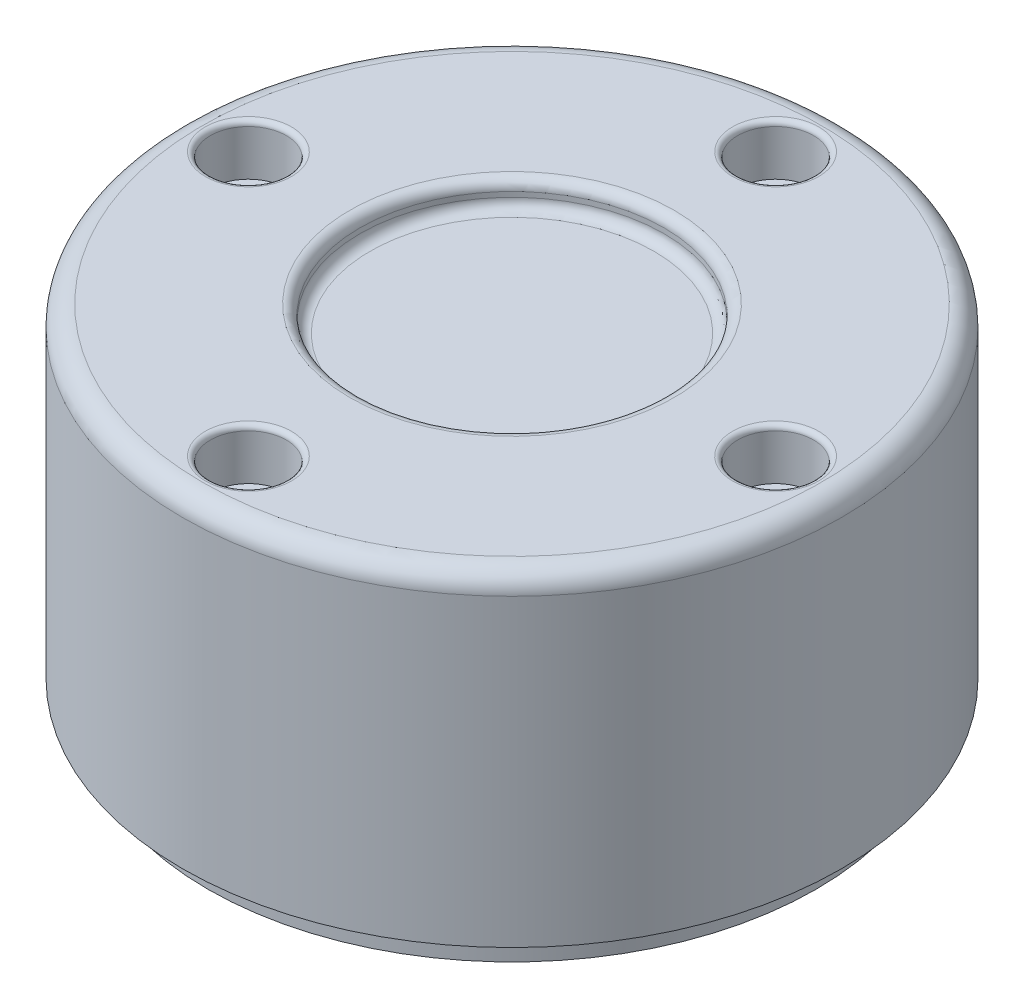
ISO-10303-21;
HEADER;
FILE_DESCRIPTION(('STEP AP214'),'2;1');
FILE_NAME('part.step','',(''),(''),'','','');
FILE_SCHEMA(('AUTOMOTIVE_DESIGN { 1 0 10303 214 1 1 1 1 }'));
ENDSEC;
DATA;
#1=APPLICATION_CONTEXT('core data for automotive mechanical design processes');
#2=APPLICATION_PROTOCOL_DEFINITION('international standard','automotive_design',2000,#1);
#3=PRODUCT_CONTEXT('',#1,'mechanical');
#4=PRODUCT('Part','Part','',(#3));
#5=PRODUCT_RELATED_PRODUCT_CATEGORY('part','',(#4));
#6=PRODUCT_DEFINITION_FORMATION('','',#4);
#7=PRODUCT_DEFINITION_CONTEXT('part definition',#1,'design');
#8=PRODUCT_DEFINITION('design','',#6,#7);
#9=PRODUCT_DEFINITION_SHAPE('','',#8);
#10=(LENGTH_UNIT() NAMED_UNIT(*) SI_UNIT(.MILLI.,.METRE.));
#11=(NAMED_UNIT(*) PLANE_ANGLE_UNIT() SI_UNIT($,.RADIAN.));
#12=(NAMED_UNIT(*) SI_UNIT($,.STERADIAN.) SOLID_ANGLE_UNIT());
#13=UNCERTAINTY_MEASURE_WITH_UNIT(LENGTH_MEASURE(1.E-05),#10,'distance_accuracy_value','');
#14=(GEOMETRIC_REPRESENTATION_CONTEXT(3) GLOBAL_UNCERTAINTY_ASSIGNED_CONTEXT((#13)) GLOBAL_UNIT_ASSIGNED_CONTEXT((#10,
#11,#12)) REPRESENTATION_CONTEXT('',''));
#15=CARTESIAN_POINT('',(0.,0.,0.));
#16=DIRECTION('',(0.,0.,1.));
#17=DIRECTION('',(1.,0.,0.));
#18=AXIS2_PLACEMENT_3D('',#15,#16,#17);
#19=CARTESIAN_POINT('',(0.,3.,0.));
#20=DIRECTION('',(0.,-1.,0.));
#21=DIRECTION('',(0.,0.,-1.));
#22=AXIS2_PLACEMENT_3D('',#19,#20,#21);
#23=CYLINDRICAL_SURFACE('',#22,30.);
#24=CARTESIAN_POINT('',(0.,3.,0.));
#25=DIRECTION('',(0.,1.,0.));
#26=DIRECTION('',(0.,0.,1.));
#27=AXIS2_PLACEMENT_3D('',#24,#25,#26);
#28=CIRCLE('',#27,30.);
#29=CARTESIAN_POINT('',(0.,3.,30.));
#30=VERTEX_POINT('',#29);
#31=EDGE_CURVE('E82',#30,#30,#28,.T.);
#32=ORIENTED_EDGE('',*,*,#31,.F.);
#33=EDGE_LOOP('',(#32));
#34=FACE_BOUND('',#33,.T.);
#35=CARTESIAN_POINT('',(0.,0.,0.));
#36=DIRECTION('',(0.,1.,0.));
#37=DIRECTION('',(0.,0.,1.));
#38=AXIS2_PLACEMENT_3D('',#35,#36,#37);
#39=CIRCLE('',#38,30.);
#40=CARTESIAN_POINT('',(0.,0.,30.));
#41=VERTEX_POINT('',#40);
#42=EDGE_CURVE('E83',#41,#41,#39,.T.);
#43=ORIENTED_EDGE('',*,*,#42,.T.);
#44=EDGE_LOOP('',(#43));
#45=FACE_BOUND('',#44,.T.);
#46=ADVANCED_FACE('F32',(#34,#45),#23,.T.);
#47=CARTESIAN_POINT('',(0.,0.,0.));
#48=DIRECTION('',(0.,1.,0.));
#49=DIRECTION('',(0.,0.,1.));
#50=AXIS2_PLACEMENT_3D('',#47,#48,#49);
#51=PLANE('',#50);
#52=ORIENTED_EDGE('',*,*,#42,.F.);
#53=EDGE_LOOP('',(#52));
#54=FACE_BOUND('',#53,.T.);
#55=ADVANCED_FACE('F121',(#54),#51,.F.);
#56=CARTESIAN_POINT('',(0.,35.,0.));
#57=DIRECTION('',(0.,-1.,0.));
#58=DIRECTION('',(0.,0.,-1.));
#59=AXIS2_PLACEMENT_3D('',#56,#57,#58);
#60=CYLINDRICAL_SURFACE('',#59,32.5);
#61=CARTESIAN_POINT('',(0.,33.,0.));
#62=DIRECTION('',(0.,1.,0.));
#63=DIRECTION('',(0.,0.,1.));
#64=AXIS2_PLACEMENT_3D('',#61,#62,#63);
#65=CIRCLE('',#64,32.5);
#66=CARTESIAN_POINT('',(0.,33.,32.5));
#67=VERTEX_POINT('',#66);
#68=EDGE_CURVE('E64',#67,#67,#65,.F.);
#69=ORIENTED_EDGE('',*,*,#68,.T.);
#70=EDGE_LOOP('',(#69));
#71=FACE_BOUND('',#70,.T.);
#72=CARTESIAN_POINT('',(0.,3.,0.));
#73=DIRECTION('',(0.,1.,0.));
#74=DIRECTION('',(0.,0.,1.));
#75=AXIS2_PLACEMENT_3D('',#72,#73,#74);
#76=CIRCLE('',#75,32.5);
#77=CARTESIAN_POINT('',(0.,3.,32.5));
#78=VERTEX_POINT('',#77);
#79=EDGE_CURVE('E86',#78,#78,#76,.T.);
#80=ORIENTED_EDGE('',*,*,#79,.T.);
#81=EDGE_LOOP('',(#80));
#82=FACE_BOUND('',#81,.T.);
#83=ADVANCED_FACE('F127',(#71,#82),#60,.T.);
#84=CARTESIAN_POINT('',(0.,35.,0.));
#85=DIRECTION('',(0.,1.,0.));
#86=DIRECTION('',(0.,0.,1.));
#87=AXIS2_PLACEMENT_3D('',#84,#85,#86);
#88=PLANE('',#87);
#89=CARTESIAN_POINT('',(26.,35.,0.));
#90=DIRECTION('',(0.,1.,0.));
#91=DIRECTION('',(0.,0.,1.));
#92=AXIS2_PLACEMENT_3D('',#89,#90,#91);
#93=CIRCLE('',#92,4.25);
#94=CARTESIAN_POINT('',(26.,35.,4.25));
#95=VERTEX_POINT('',#94);
#96=EDGE_CURVE('E47',#95,#95,#93,.F.);
#97=ORIENTED_EDGE('',*,*,#96,.T.);
#98=EDGE_LOOP('',(#97));
#99=FACE_BOUND('',#98,.T.);
#100=CARTESIAN_POINT('',(0.,35.,-26.));
#101=DIRECTION('',(0.,1.,0.));
#102=DIRECTION('',(0.,0.,1.));
#103=AXIS2_PLACEMENT_3D('',#100,#101,#102);
#104=CIRCLE('',#103,4.25);
#105=CARTESIAN_POINT('',(0.,35.,-21.75));
#106=VERTEX_POINT('',#105);
#107=EDGE_CURVE('E52',#106,#106,#104,.F.);
#108=ORIENTED_EDGE('',*,*,#107,.T.);
#109=EDGE_LOOP('',(#108));
#110=FACE_BOUND('',#109,.T.);
#111=CARTESIAN_POINT('',(-26.,35.,0.));
#112=DIRECTION('',(0.,1.,0.));
#113=DIRECTION('',(0.,0.,1.));
#114=AXIS2_PLACEMENT_3D('',#111,#112,#113);
#115=CIRCLE('',#114,4.25);
#116=CARTESIAN_POINT('',(-26.,35.,4.25000000000001));
#117=VERTEX_POINT('',#116);
#118=EDGE_CURVE('E55',#117,#117,#115,.F.);
#119=ORIENTED_EDGE('',*,*,#118,.T.);
#120=EDGE_LOOP('',(#119));
#121=FACE_BOUND('',#120,.T.);
#122=CARTESIAN_POINT('',(0.,35.,26.));
#123=DIRECTION('',(0.,1.,0.));
#124=DIRECTION('',(0.,0.,1.));
#125=AXIS2_PLACEMENT_3D('',#122,#123,#124);
#126=CIRCLE('',#125,4.25000000000001);
#127=CARTESIAN_POINT('',(0.,35.,30.25));
#128=VERTEX_POINT('',#127);
#129=EDGE_CURVE('E58',#128,#128,#126,.F.);
#130=ORIENTED_EDGE('',*,*,#129,.T.);
#131=EDGE_LOOP('',(#130));
#132=FACE_BOUND('',#131,.T.);
#133=CARTESIAN_POINT('',(0.,35.,0.));
#134=DIRECTION('',(0.,1.,0.));
#135=DIRECTION('',(0.,0.,1.));
#136=AXIS2_PLACEMENT_3D('',#133,#134,#135);
#137=CIRCLE('',#136,30.5);
#138=CARTESIAN_POINT('',(0.,35.,30.5));
#139=VERTEX_POINT('',#138);
#140=EDGE_CURVE('E67',#139,#139,#137,.T.);
#141=ORIENTED_EDGE('',*,*,#140,.T.);
#142=EDGE_LOOP('',(#141));
#143=FACE_BOUND('',#142,.T.);
#144=CARTESIAN_POINT('',(0.,35.,0.));
#145=DIRECTION('',(0.,1.,0.));
#146=DIRECTION('',(0.,0.,1.));
#147=AXIS2_PLACEMENT_3D('',#144,#145,#146);
#148=CIRCLE('',#147,16.);
#149=CARTESIAN_POINT('',(0.,35.,16.));
#150=VERTEX_POINT('',#149);
#151=EDGE_CURVE('E70',#150,#150,#148,.F.);
#152=ORIENTED_EDGE('',*,*,#151,.T.);
#153=EDGE_LOOP('',(#152));
#154=FACE_BOUND('',#153,.T.);
#155=ADVANCED_FACE('F162',(#99,#110,#121,#132,#143,#154),#88,.T.);
#156=CARTESIAN_POINT('',(0.,3.,0.));
#157=DIRECTION('',(0.,1.,0.));
#158=DIRECTION('',(0.,0.,1.));
#159=AXIS2_PLACEMENT_3D('',#156,#157,#158);
#160=PLANE('',#159);
#161=ORIENTED_EDGE('',*,*,#31,.T.);
#162=EDGE_LOOP('',(#161));
#163=FACE_BOUND('',#162,.T.);
#164=ORIENTED_EDGE('',*,*,#79,.F.);
#165=EDGE_LOOP('',(#164));
#166=FACE_BOUND('',#165,.T.);
#167=ADVANCED_FACE('F165',(#163,#166),#160,.F.);
#168=CARTESIAN_POINT('',(0.,32.5,0.));
#169=DIRECTION('',(0.,1.,0.));
#170=DIRECTION('',(0.,0.,1.));
#171=AXIS2_PLACEMENT_3D('',#168,#169,#170);
#172=CYLINDRICAL_SURFACE('',#171,15.);
#173=CARTESIAN_POINT('',(0.,34.,0.));
#174=DIRECTION('',(0.,1.,0.));
#175=DIRECTION('',(0.,0.,1.));
#176=AXIS2_PLACEMENT_3D('',#173,#174,#175);
#177=CIRCLE('',#176,15.);
#178=CARTESIAN_POINT('',(0.,34.,15.));
#179=VERTEX_POINT('',#178);
#180=EDGE_CURVE('E73',#179,#179,#177,.T.);
#181=ORIENTED_EDGE('',*,*,#180,.T.);
#182=EDGE_LOOP('',(#181));
#183=FACE_BOUND('',#182,.T.);
#184=CARTESIAN_POINT('',(0.,33.5,0.));
#185=DIRECTION('',(0.,1.,0.));
#186=DIRECTION('',(0.,0.,1.));
#187=AXIS2_PLACEMENT_3D('',#184,#185,#186);
#188=CIRCLE('',#187,15.);
#189=CARTESIAN_POINT('',(0.,33.5,15.));
#190=VERTEX_POINT('',#189);
#191=EDGE_CURVE('E76',#190,#190,#188,.F.);
#192=ORIENTED_EDGE('',*,*,#191,.T.);
#193=EDGE_LOOP('',(#192));
#194=FACE_BOUND('',#193,.T.);
#195=ADVANCED_FACE('F176',(#183,#194),#172,.F.);
#196=CARTESIAN_POINT('',(0.,32.5,0.));
#197=DIRECTION('',(0.,1.,0.));
#198=DIRECTION('',(0.,0.,1.));
#199=AXIS2_PLACEMENT_3D('',#196,#197,#198);
#200=PLANE('',#199);
#201=CARTESIAN_POINT('',(0.,32.5,0.));
#202=DIRECTION('',(0.,1.,0.));
#203=DIRECTION('',(0.,0.,1.));
#204=AXIS2_PLACEMENT_3D('',#201,#202,#203);
#205=CIRCLE('',#204,14.);
#206=CARTESIAN_POINT('',(0.,32.5,14.));
#207=VERTEX_POINT('',#206);
#208=EDGE_CURVE('E79',#207,#207,#205,.T.);
#209=ORIENTED_EDGE('',*,*,#208,.T.);
#210=EDGE_LOOP('',(#209));
#211=FACE_BOUND('',#210,.T.);
#212=ADVANCED_FACE('F179',(#211),#200,.T.);
#213=CARTESIAN_POINT('',(-26.,30.,0.));
#214=DIRECTION('',(0.,1.,0.));
#215=DIRECTION('',(0.,0.,1.));
#216=AXIS2_PLACEMENT_3D('',#213,#214,#215);
#217=CYLINDRICAL_SURFACE('',#216,3.75);
#218=CARTESIAN_POINT('',(-26.,34.5,0.));
#219=DIRECTION('',(0.,1.,0.));
#220=DIRECTION('',(0.,0.,1.));
#221=AXIS2_PLACEMENT_3D('',#218,#219,#220);
#222=CIRCLE('',#221,3.75);
#223=CARTESIAN_POINT('',(-26.,34.5,3.75));
#224=VERTEX_POINT('',#223);
#225=EDGE_CURVE('E39',#224,#224,#222,.T.);
#226=ORIENTED_EDGE('',*,*,#225,.T.);
#227=EDGE_LOOP('',(#226));
#228=FACE_BOUND('',#227,.T.);
#229=CARTESIAN_POINT('',(-26.,30.,0.));
#230=DIRECTION('',(0.,1.,0.));
#231=DIRECTION('',(0.,0.,1.));
#232=AXIS2_PLACEMENT_3D('',#229,#230,#231);
#233=CIRCLE('',#232,3.75);
#234=CARTESIAN_POINT('',(-26.,30.,3.75));
#235=VERTEX_POINT('',#234);
#236=EDGE_CURVE('E91',#235,#235,#233,.T.);
#237=ORIENTED_EDGE('',*,*,#236,.F.);
#238=EDGE_LOOP('',(#237));
#239=FACE_BOUND('',#238,.T.);
#240=ADVANCED_FACE('F186',(#228,#239),#217,.F.);
#241=CARTESIAN_POINT('',(0.,30.,0.));
#242=DIRECTION('',(0.,1.,0.));
#243=DIRECTION('',(0.,0.,1.));
#244=AXIS2_PLACEMENT_3D('',#241,#242,#243);
#245=PLANE('',#244);
#246=ORIENTED_EDGE('',*,*,#236,.T.);
#247=EDGE_LOOP('',(#246));
#248=FACE_BOUND('',#247,.T.);
#249=ADVANCED_FACE('F191',(#248),#245,.T.);
#250=CARTESIAN_POINT('',(0.,30.,26.));
#251=DIRECTION('',(0.,1.,0.));
#252=DIRECTION('',(0.,0.,1.));
#253=AXIS2_PLACEMENT_3D('',#250,#251,#252);
#254=CYLINDRICAL_SURFACE('',#253,3.75000000000001);
#255=CARTESIAN_POINT('',(0.,34.5,26.));
#256=DIRECTION('',(0.,1.,0.));
#257=DIRECTION('',(0.,0.,1.));
#258=AXIS2_PLACEMENT_3D('',#255,#256,#257);
#259=CIRCLE('',#258,3.75000000000001);
#260=CARTESIAN_POINT('',(0.,34.5,29.75));
#261=VERTEX_POINT('',#260);
#262=EDGE_CURVE('E10',#261,#261,#259,.T.);
#263=ORIENTED_EDGE('',*,*,#262,.T.);
#264=EDGE_LOOP('',(#263));
#265=FACE_BOUND('',#264,.T.);
#266=CARTESIAN_POINT('',(0.,30.,26.));
#267=DIRECTION('',(0.,1.,0.));
#268=DIRECTION('',(0.,0.,1.));
#269=AXIS2_PLACEMENT_3D('',#266,#267,#268);
#270=CIRCLE('',#269,3.75000000000001);
#271=CARTESIAN_POINT('',(0.,30.,29.75));
#272=VERTEX_POINT('',#271);
#273=EDGE_CURVE('E95',#272,#272,#270,.T.);
#274=ORIENTED_EDGE('',*,*,#273,.F.);
#275=EDGE_LOOP('',(#274));
#276=FACE_BOUND('',#275,.T.);
#277=ADVANCED_FACE('F284',(#265,#276),#254,.F.);
#278=CARTESIAN_POINT('',(0.,30.,26.));
#279=DIRECTION('',(0.,1.,0.));
#280=DIRECTION('',(0.,0.,1.));
#281=AXIS2_PLACEMENT_3D('',#278,#279,#280);
#282=PLANE('',#281);
#283=ORIENTED_EDGE('',*,*,#273,.T.);
#284=EDGE_LOOP('',(#283));
#285=FACE_BOUND('',#284,.T.);
#286=ADVANCED_FACE('F276',(#285),#282,.T.);
#287=CARTESIAN_POINT('',(26.,30.,0.));
#288=DIRECTION('',(0.,1.,0.));
#289=DIRECTION('',(0.,0.,1.));
#290=AXIS2_PLACEMENT_3D('',#287,#288,#289);
#291=CYLINDRICAL_SURFACE('',#290,3.75);
#292=CARTESIAN_POINT('',(26.,34.5,0.));
#293=DIRECTION('',(0.,1.,0.));
#294=DIRECTION('',(0.,0.,1.));
#295=AXIS2_PLACEMENT_3D('',#292,#293,#294);
#296=CIRCLE('',#295,3.75);
#297=CARTESIAN_POINT('',(26.,34.5,3.75));
#298=VERTEX_POINT('',#297);
#299=EDGE_CURVE('E61',#298,#298,#296,.T.);
#300=ORIENTED_EDGE('',*,*,#299,.T.);
#301=EDGE_LOOP('',(#300));
#302=FACE_BOUND('',#301,.T.);
#303=CARTESIAN_POINT('',(26.,30.,0.));
#304=DIRECTION('',(0.,1.,0.));
#305=DIRECTION('',(0.,0.,1.));
#306=AXIS2_PLACEMENT_3D('',#303,#304,#305);
#307=CIRCLE('',#306,3.75);
#308=CARTESIAN_POINT('',(26.,30.,3.75));
#309=VERTEX_POINT('',#308);
#310=EDGE_CURVE('E98',#309,#309,#307,.T.);
#311=ORIENTED_EDGE('',*,*,#310,.F.);
#312=EDGE_LOOP('',(#311));
#313=FACE_BOUND('',#312,.T.);
#314=ADVANCED_FACE('F117',(#302,#313),#291,.F.);
#315=CARTESIAN_POINT('',(0.,30.,0.));
#316=DIRECTION('',(0.,1.,0.));
#317=DIRECTION('',(0.,0.,1.));
#318=AXIS2_PLACEMENT_3D('',#315,#316,#317);
#319=PLANE('',#318);
#320=ORIENTED_EDGE('',*,*,#310,.T.);
#321=EDGE_LOOP('',(#320));
#322=FACE_BOUND('',#321,.T.);
#323=ADVANCED_FACE('F108',(#322),#319,.T.);
#324=CARTESIAN_POINT('',(0.,30.,-26.));
#325=DIRECTION('',(0.,1.,0.));
#326=DIRECTION('',(0.,0.,1.));
#327=AXIS2_PLACEMENT_3D('',#324,#325,#326);
#328=CYLINDRICAL_SURFACE('',#327,3.75);
#329=CARTESIAN_POINT('',(0.,34.5,-26.));
#330=DIRECTION('',(0.,1.,0.));
#331=DIRECTION('',(0.,0.,1.));
#332=AXIS2_PLACEMENT_3D('',#329,#330,#331);
#333=CIRCLE('',#332,3.75);
#334=CARTESIAN_POINT('',(0.,34.5,-22.25));
#335=VERTEX_POINT('',#334);
#336=EDGE_CURVE('E43',#335,#335,#333,.T.);
#337=ORIENTED_EDGE('',*,*,#336,.T.);
#338=EDGE_LOOP('',(#337));
#339=FACE_BOUND('',#338,.T.);
#340=CARTESIAN_POINT('',(0.,30.,-26.));
#341=DIRECTION('',(0.,1.,0.));
#342=DIRECTION('',(0.,0.,1.));
#343=AXIS2_PLACEMENT_3D('',#340,#341,#342);
#344=CIRCLE('',#343,3.75);
#345=CARTESIAN_POINT('',(0.,30.,-22.25));
#346=VERTEX_POINT('',#345);
#347=EDGE_CURVE('E94',#346,#346,#344,.T.);
#348=ORIENTED_EDGE('',*,*,#347,.F.);
#349=EDGE_LOOP('',(#348));
#350=FACE_BOUND('',#349,.T.);
#351=ADVANCED_FACE('F106',(#339,#350),#328,.F.);
#352=CARTESIAN_POINT('',(0.,30.,0.));
#353=DIRECTION('',(0.,1.,0.));
#354=DIRECTION('',(0.,0.,1.));
#355=AXIS2_PLACEMENT_3D('',#352,#353,#354);
#356=PLANE('',#355);
#357=ORIENTED_EDGE('',*,*,#347,.T.);
#358=EDGE_LOOP('',(#357));
#359=FACE_BOUND('',#358,.T.);
#360=ADVANCED_FACE('F104',(#359),#356,.T.);
#361=CARTESIAN_POINT('',(0.,33.5,0.));
#362=DIRECTION('',(0.,1.,0.));
#363=DIRECTION('',(0.,0.,1.));
#364=AXIS2_PLACEMENT_3D('',#361,#362,#363);
#365=TOROIDAL_SURFACE('',#364,14.,1.);
#366=ORIENTED_EDGE('',*,*,#191,.F.);
#367=EDGE_LOOP('',(#366));
#368=FACE_BOUND('',#367,.T.);
#369=ORIENTED_EDGE('',*,*,#208,.F.);
#370=EDGE_LOOP('',(#369));
#371=FACE_BOUND('',#370,.T.);
#372=ADVANCED_FACE('F115',(#368,#371),#365,.F.);
#373=CARTESIAN_POINT('',(0.,34.,0.));
#374=DIRECTION('',(0.,1.,0.));
#375=DIRECTION('',(0.,0.,1.));
#376=AXIS2_PLACEMENT_3D('',#373,#374,#375);
#377=TOROIDAL_SURFACE('',#376,16.,1.);
#378=ORIENTED_EDGE('',*,*,#151,.F.);
#379=EDGE_LOOP('',(#378));
#380=FACE_BOUND('',#379,.T.);
#381=ORIENTED_EDGE('',*,*,#180,.F.);
#382=EDGE_LOOP('',(#381));
#383=FACE_BOUND('',#382,.T.);
#384=ADVANCED_FACE('F136',(#380,#383),#377,.T.);
#385=CARTESIAN_POINT('',(0.,33.,0.));
#386=DIRECTION('',(0.,1.,0.));
#387=DIRECTION('',(0.,0.,1.));
#388=AXIS2_PLACEMENT_3D('',#385,#386,#387);
#389=TOROIDAL_SURFACE('',#388,30.5,2.);
#390=ORIENTED_EDGE('',*,*,#68,.F.);
#391=EDGE_LOOP('',(#390));
#392=FACE_BOUND('',#391,.T.);
#393=ORIENTED_EDGE('',*,*,#140,.F.);
#394=EDGE_LOOP('',(#393));
#395=FACE_BOUND('',#394,.T.);
#396=ADVANCED_FACE('F140',(#392,#395),#389,.T.);
#397=CARTESIAN_POINT('',(26.,34.5,0.));
#398=DIRECTION('',(0.,1.,0.));
#399=DIRECTION('',(0.,0.,1.));
#400=AXIS2_PLACEMENT_3D('',#397,#398,#399);
#401=TOROIDAL_SURFACE('',#400,4.25,0.5);
#402=ORIENTED_EDGE('',*,*,#96,.F.);
#403=EDGE_LOOP('',(#402));
#404=FACE_BOUND('',#403,.T.);
#405=ORIENTED_EDGE('',*,*,#299,.F.);
#406=EDGE_LOOP('',(#405));
#407=FACE_BOUND('',#406,.T.);
#408=ADVANCED_FACE('F144',(#404,#407),#401,.T.);
#409=CARTESIAN_POINT('',(0.,34.5,-26.));
#410=DIRECTION('',(0.,1.,0.));
#411=DIRECTION('',(0.,0.,1.));
#412=AXIS2_PLACEMENT_3D('',#409,#410,#411);
#413=TOROIDAL_SURFACE('',#412,4.25,0.5);
#414=ORIENTED_EDGE('',*,*,#107,.F.);
#415=EDGE_LOOP('',(#414));
#416=FACE_BOUND('',#415,.T.);
#417=ORIENTED_EDGE('',*,*,#336,.F.);
#418=EDGE_LOOP('',(#417));
#419=FACE_BOUND('',#418,.T.);
#420=ADVANCED_FACE('F148',(#416,#419),#413,.T.);
#421=CARTESIAN_POINT('',(-26.,34.5,0.));
#422=DIRECTION('',(0.,1.,0.));
#423=DIRECTION('',(0.,0.,1.));
#424=AXIS2_PLACEMENT_3D('',#421,#422,#423);
#425=TOROIDAL_SURFACE('',#424,4.25,0.5);
#426=ORIENTED_EDGE('',*,*,#118,.F.);
#427=EDGE_LOOP('',(#426));
#428=FACE_BOUND('',#427,.T.);
#429=ORIENTED_EDGE('',*,*,#225,.F.);
#430=EDGE_LOOP('',(#429));
#431=FACE_BOUND('',#430,.T.);
#432=ADVANCED_FACE('F151',(#428,#431),#425,.T.);
#433=CARTESIAN_POINT('',(0.,34.5,26.));
#434=DIRECTION('',(0.,1.,0.));
#435=DIRECTION('',(0.,0.,1.));
#436=AXIS2_PLACEMENT_3D('',#433,#434,#435);
#437=TOROIDAL_SURFACE('',#436,4.25000000000001,0.5);
#438=ORIENTED_EDGE('',*,*,#129,.F.);
#439=EDGE_LOOP('',(#438));
#440=FACE_BOUND('',#439,.T.);
#441=ORIENTED_EDGE('',*,*,#262,.F.);
#442=EDGE_LOOP('',(#441));
#443=FACE_BOUND('',#442,.T.);
#444=ADVANCED_FACE('F34',(#440,#443),#437,.T.);
#445=CLOSED_SHELL('',(#46,#55,#83,#155,#167,#195,#212,#240,#249,#277,#286,#314,#323,#351,#360,
#372,#384,#396,#408,#420,#432,#444));
#446=MANIFOLD_SOLID_BREP('B2',#445);
#447=ADVANCED_BREP_SHAPE_REPRESENTATION('',(#18,#446),#14);
#448=SHAPE_DEFINITION_REPRESENTATION(#9,#447);
ENDSEC;
END-ISO-10303-21;
